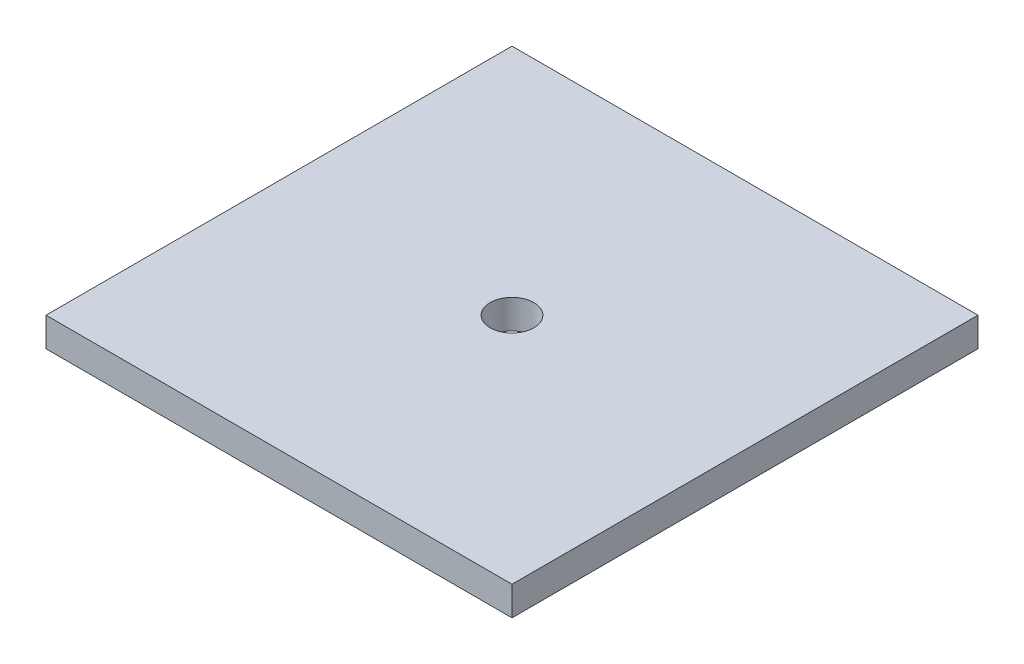
ISO-10303-21;
HEADER;
FILE_DESCRIPTION(('STEP AP214'),'2;1');
FILE_NAME('part.step','',(''),(''),'','','');
FILE_SCHEMA(('AUTOMOTIVE_DESIGN { 1 0 10303 214 1 1 1 1 }'));
ENDSEC;
DATA;
#1=APPLICATION_CONTEXT('core data for automotive mechanical design processes');
#2=APPLICATION_PROTOCOL_DEFINITION('international standard','automotive_design',2000,#1);
#3=PRODUCT_CONTEXT('',#1,'mechanical');
#4=PRODUCT('Part','Part','',(#3));
#5=PRODUCT_RELATED_PRODUCT_CATEGORY('part','',(#4));
#6=PRODUCT_DEFINITION_FORMATION('','',#4);
#7=PRODUCT_DEFINITION_CONTEXT('part definition',#1,'design');
#8=PRODUCT_DEFINITION('design','',#6,#7);
#9=PRODUCT_DEFINITION_SHAPE('','',#8);
#10=(LENGTH_UNIT() NAMED_UNIT(*) SI_UNIT(.MILLI.,.METRE.));
#11=(NAMED_UNIT(*) PLANE_ANGLE_UNIT() SI_UNIT($,.RADIAN.));
#12=(NAMED_UNIT(*) SI_UNIT($,.STERADIAN.) SOLID_ANGLE_UNIT());
#13=UNCERTAINTY_MEASURE_WITH_UNIT(LENGTH_MEASURE(1.E-05),#10,'distance_accuracy_value','');
#14=(GEOMETRIC_REPRESENTATION_CONTEXT(3) GLOBAL_UNCERTAINTY_ASSIGNED_CONTEXT((#13)) GLOBAL_UNIT_ASSIGNED_CONTEXT((#10,
#11,#12)) REPRESENTATION_CONTEXT('',''));
#15=CARTESIAN_POINT('',(0.,0.,0.));
#16=DIRECTION('',(0.,0.,1.));
#17=DIRECTION('',(1.,0.,0.));
#18=AXIS2_PLACEMENT_3D('',#15,#16,#17);
#19=CARTESIAN_POINT('',(0.,12.7,0.));
#20=DIRECTION('',(0.,-1.,0.));
#21=DIRECTION('',(0.,0.,-1.));
#22=AXIS2_PLACEMENT_3D('',#19,#20,#21);
#23=PLANE('',#22);
#24=DIRECTION('',(0.,0.,-1.));
#25=VECTOR('',#24,1.);
#26=CARTESIAN_POINT('',(101.6,12.7,101.6));
#27=LINE('',#26,#25);
#28=CARTESIAN_POINT('',(101.6,12.7,101.6));
#29=VERTEX_POINT('',#28);
#30=CARTESIAN_POINT('',(101.6,12.7,-101.6));
#31=VERTEX_POINT('',#30);
#32=EDGE_CURVE('E96',#29,#31,#27,.T.);
#33=ORIENTED_EDGE('',*,*,#32,.T.);
#34=DIRECTION('',(-1.,0.,0.));
#35=VECTOR('',#34,1.);
#36=CARTESIAN_POINT('',(-101.6,12.7,-101.6));
#37=LINE('',#36,#35);
#38=CARTESIAN_POINT('',(-101.6,12.7,-101.6));
#39=VERTEX_POINT('',#38);
#40=EDGE_CURVE('E91',#31,#39,#37,.T.);
#41=ORIENTED_EDGE('',*,*,#40,.T.);
#42=DIRECTION('',(0.,0.,1.));
#43=VECTOR('',#42,1.);
#44=CARTESIAN_POINT('',(-101.6,12.7,101.6));
#45=LINE('',#44,#43);
#46=CARTESIAN_POINT('',(-101.6,12.7,101.6));
#47=VERTEX_POINT('',#46);
#48=EDGE_CURVE('E94',#39,#47,#45,.T.);
#49=ORIENTED_EDGE('',*,*,#48,.T.);
#50=DIRECTION('',(1.,0.,0.));
#51=VECTOR('',#50,1.);
#52=CARTESIAN_POINT('',(-101.6,12.7,101.6));
#53=LINE('',#52,#51);
#54=EDGE_CURVE('E61',#47,#29,#53,.T.);
#55=ORIENTED_EDGE('',*,*,#54,.T.);
#56=EDGE_LOOP('',(#33,#41,#49,#55));
#57=FACE_BOUND('',#56,.T.);
#58=CARTESIAN_POINT('',(0.,12.7,0.));
#59=DIRECTION('',(0.,1.,0.));
#60=DIRECTION('',(0.,0.,1.));
#61=AXIS2_PLACEMENT_3D('',#58,#59,#60);
#62=CIRCLE('',#61,9.525);
#63=CARTESIAN_POINT('',(0.,12.7,9.52499999999997));
#64=VERTEX_POINT('',#63);
#65=EDGE_CURVE('E116',#64,#64,#62,.T.);
#66=ORIENTED_EDGE('',*,*,#65,.F.);
#67=EDGE_LOOP('',(#66));
#68=FACE_BOUND('',#67,.T.);
#69=ADVANCED_FACE('F43',(#57,#68),#23,.F.);
#70=CARTESIAN_POINT('',(0.,0.,0.));
#71=DIRECTION('',(0.,-1.,0.));
#72=DIRECTION('',(0.,0.,-1.));
#73=AXIS2_PLACEMENT_3D('',#70,#71,#72);
#74=PLANE('',#73);
#75=DIRECTION('',(0.,0.,-1.));
#76=VECTOR('',#75,1.);
#77=CARTESIAN_POINT('',(101.6,0.,101.6));
#78=LINE('',#77,#76);
#79=CARTESIAN_POINT('',(101.6,0.,101.6));
#80=VERTEX_POINT('',#79);
#81=CARTESIAN_POINT('',(101.6,0.,-101.6));
#82=VERTEX_POINT('',#81);
#83=EDGE_CURVE('E112',#80,#82,#78,.T.);
#84=ORIENTED_EDGE('',*,*,#83,.F.);
#85=DIRECTION('',(1.,0.,0.));
#86=VECTOR('',#85,1.);
#87=CARTESIAN_POINT('',(-101.6,0.,101.6));
#88=LINE('',#87,#86);
#89=CARTESIAN_POINT('',(-101.6,0.,101.6));
#90=VERTEX_POINT('',#89);
#91=EDGE_CURVE('E84',#90,#80,#88,.T.);
#92=ORIENTED_EDGE('',*,*,#91,.F.);
#93=DIRECTION('',(0.,0.,1.));
#94=VECTOR('',#93,1.);
#95=CARTESIAN_POINT('',(-101.6,0.,101.6));
#96=LINE('',#95,#94);
#97=CARTESIAN_POINT('',(-101.6,0.,-101.6));
#98=VERTEX_POINT('',#97);
#99=EDGE_CURVE('E78',#98,#90,#96,.T.);
#100=ORIENTED_EDGE('',*,*,#99,.F.);
#101=DIRECTION('',(-1.,0.,0.));
#102=VECTOR('',#101,1.);
#103=CARTESIAN_POINT('',(-101.6,0.,-101.6));
#104=LINE('',#103,#102);
#105=EDGE_CURVE('E101',#82,#98,#104,.T.);
#106=ORIENTED_EDGE('',*,*,#105,.F.);
#107=EDGE_LOOP('',(#84,#92,#100,#106));
#108=FACE_BOUND('',#107,.T.);
#109=CARTESIAN_POINT('',(0.,0.,0.));
#110=DIRECTION('',(0.,1.,0.));
#111=DIRECTION('',(0.,0.,1.));
#112=AXIS2_PLACEMENT_3D('',#109,#110,#111);
#113=CIRCLE('',#112,9.525);
#114=CARTESIAN_POINT('',(0.,0.,9.52499999999997));
#115=VERTEX_POINT('',#114);
#116=EDGE_CURVE('E134',#115,#115,#113,.T.);
#117=ORIENTED_EDGE('',*,*,#116,.T.);
#118=EDGE_LOOP('',(#117));
#119=FACE_BOUND('',#118,.T.);
#120=ADVANCED_FACE('F129',(#108,#119),#74,.T.);
#121=CARTESIAN_POINT('',(101.6,12.7,101.6));
#122=DIRECTION('',(-1.,0.,0.));
#123=DIRECTION('',(0.,0.,1.));
#124=AXIS2_PLACEMENT_3D('',#121,#122,#123);
#125=PLANE('',#124);
#126=ORIENTED_EDGE('',*,*,#83,.T.);
#127=DIRECTION('',(0.,-1.,0.));
#128=VECTOR('',#127,1.);
#129=CARTESIAN_POINT('',(101.6,12.7,-101.6));
#130=LINE('',#129,#128);
#131=EDGE_CURVE('E11',#31,#82,#130,.T.);
#132=ORIENTED_EDGE('',*,*,#131,.F.);
#133=ORIENTED_EDGE('',*,*,#32,.F.);
#134=DIRECTION('',(0.,-1.,0.));
#135=VECTOR('',#134,1.);
#136=CARTESIAN_POINT('',(101.6,12.7,101.6));
#137=LINE('',#136,#135);
#138=EDGE_CURVE('E108',#29,#80,#137,.T.);
#139=ORIENTED_EDGE('',*,*,#138,.T.);
#140=EDGE_LOOP('',(#126,#132,#133,#139));
#141=FACE_BOUND('',#140,.T.);
#142=ADVANCED_FACE('F45',(#141),#125,.F.);
#143=CARTESIAN_POINT('',(-101.6,12.7,-101.6));
#144=DIRECTION('',(0.,0.,1.));
#145=DIRECTION('',(1.,0.,0.));
#146=AXIS2_PLACEMENT_3D('',#143,#144,#145);
#147=PLANE('',#146);
#148=ORIENTED_EDGE('',*,*,#105,.T.);
#149=DIRECTION('',(0.,-1.,0.));
#150=VECTOR('',#149,1.);
#151=CARTESIAN_POINT('',(-101.6,12.7,-101.6));
#152=LINE('',#151,#150);
#153=EDGE_CURVE('E53',#39,#98,#152,.T.);
#154=ORIENTED_EDGE('',*,*,#153,.F.);
#155=ORIENTED_EDGE('',*,*,#40,.F.);
#156=ORIENTED_EDGE('',*,*,#131,.T.);
#157=EDGE_LOOP('',(#148,#154,#155,#156));
#158=FACE_BOUND('',#157,.T.);
#159=ADVANCED_FACE('F100',(#158),#147,.F.);
#160=CARTESIAN_POINT('',(-101.6,12.7,101.6));
#161=DIRECTION('',(1.,0.,0.));
#162=DIRECTION('',(0.,0.,-1.));
#163=AXIS2_PLACEMENT_3D('',#160,#161,#162);
#164=PLANE('',#163);
#165=ORIENTED_EDGE('',*,*,#99,.T.);
#166=DIRECTION('',(0.,-1.,0.));
#167=VECTOR('',#166,1.);
#168=CARTESIAN_POINT('',(-101.6,12.7,101.6));
#169=LINE('',#168,#167);
#170=EDGE_CURVE('E103',#47,#90,#169,.T.);
#171=ORIENTED_EDGE('',*,*,#170,.F.);
#172=ORIENTED_EDGE('',*,*,#48,.F.);
#173=ORIENTED_EDGE('',*,*,#153,.T.);
#174=EDGE_LOOP('',(#165,#171,#172,#173));
#175=FACE_BOUND('',#174,.T.);
#176=ADVANCED_FACE('F104',(#175),#164,.F.);
#177=CARTESIAN_POINT('',(-101.6,12.7,101.6));
#178=DIRECTION('',(0.,0.,-1.));
#179=DIRECTION('',(-1.,0.,0.));
#180=AXIS2_PLACEMENT_3D('',#177,#178,#179);
#181=PLANE('',#180);
#182=ORIENTED_EDGE('',*,*,#91,.T.);
#183=ORIENTED_EDGE('',*,*,#138,.F.);
#184=ORIENTED_EDGE('',*,*,#54,.F.);
#185=ORIENTED_EDGE('',*,*,#170,.T.);
#186=EDGE_LOOP('',(#182,#183,#184,#185));
#187=FACE_BOUND('',#186,.T.);
#188=ADVANCED_FACE('F126',(#187),#181,.F.);
#189=CARTESIAN_POINT('',(0.,12.7,0.));
#190=DIRECTION('',(0.,-1.,0.));
#191=DIRECTION('',(0.,0.,-1.));
#192=AXIS2_PLACEMENT_3D('',#189,#190,#191);
#193=CYLINDRICAL_SURFACE('',#192,9.525);
#194=ORIENTED_EDGE('',*,*,#65,.T.);
#195=EDGE_LOOP('',(#194));
#196=FACE_BOUND('',#195,.T.);
#197=ORIENTED_EDGE('',*,*,#116,.F.);
#198=EDGE_LOOP('',(#197));
#199=FACE_BOUND('',#198,.T.);
#200=ADVANCED_FACE('F142',(#196,#199),#193,.F.);
#201=CLOSED_SHELL('',(#69,#120,#142,#159,#176,#188,#200));
#202=MANIFOLD_SOLID_BREP('B2',#201);
#203=ADVANCED_BREP_SHAPE_REPRESENTATION('',(#18,#202),#14);
#204=SHAPE_DEFINITION_REPRESENTATION(#9,#203);
ENDSEC;
END-ISO-10303-21;
